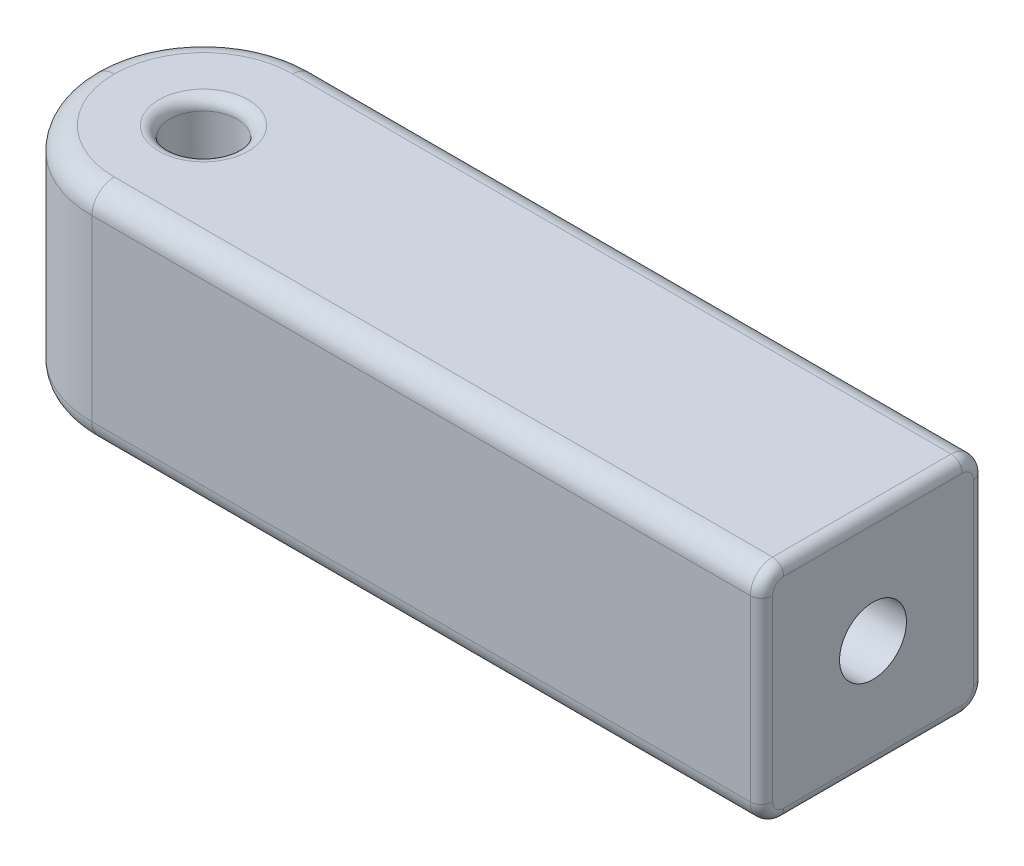
ISO-10303-21;
HEADER;
FILE_DESCRIPTION(('STEP AP214'),'2;1');
FILE_NAME('part.step','',(''),(''),'','','');
FILE_SCHEMA(('AUTOMOTIVE_DESIGN { 1 0 10303 214 1 1 1 1 }'));
ENDSEC;
DATA;
#1=APPLICATION_CONTEXT('core data for automotive mechanical design processes');
#2=APPLICATION_PROTOCOL_DEFINITION('international standard','automotive_design',2000,#1);
#3=PRODUCT_CONTEXT('',#1,'mechanical');
#4=PRODUCT('Part','Part','',(#3));
#5=PRODUCT_RELATED_PRODUCT_CATEGORY('part','',(#4));
#6=PRODUCT_DEFINITION_FORMATION('','',#4);
#7=PRODUCT_DEFINITION_CONTEXT('part definition',#1,'design');
#8=PRODUCT_DEFINITION('design','',#6,#7);
#9=PRODUCT_DEFINITION_SHAPE('','',#8);
#10=(LENGTH_UNIT() NAMED_UNIT(*) SI_UNIT(.MILLI.,.METRE.));
#11=(NAMED_UNIT(*) PLANE_ANGLE_UNIT() SI_UNIT($,.RADIAN.));
#12=(NAMED_UNIT(*) SI_UNIT($,.STERADIAN.) SOLID_ANGLE_UNIT());
#13=UNCERTAINTY_MEASURE_WITH_UNIT(LENGTH_MEASURE(1.E-05),#10,'distance_accuracy_value','');
#14=(GEOMETRIC_REPRESENTATION_CONTEXT(3) GLOBAL_UNCERTAINTY_ASSIGNED_CONTEXT((#13)) GLOBAL_UNIT_ASSIGNED_CONTEXT((#10,
#11,#12)) REPRESENTATION_CONTEXT('',''));
#15=CARTESIAN_POINT('',(0.,0.,0.));
#16=DIRECTION('',(0.,0.,1.));
#17=DIRECTION('',(1.,0.,0.));
#18=AXIS2_PLACEMENT_3D('',#15,#16,#17);
#19=CARTESIAN_POINT('',(0.,0.,50.));
#20=DIRECTION('',(0.,1.,0.));
#21=DIRECTION('',(0.,0.,1.));
#22=AXIS2_PLACEMENT_3D('',#19,#20,#21);
#23=PLANE('',#22);
#24=CARTESIAN_POINT('',(25.,0.,25.));
#25=DIRECTION('',(0.,1.,0.));
#26=DIRECTION('',(0.,0.,1.));
#27=AXIS2_PLACEMENT_3D('',#24,#25,#26);
#28=CIRCLE('',#27,10.);
#29=CARTESIAN_POINT('',(25.,0.,35.));
#30=VERTEX_POINT('',#29);
#31=EDGE_CURVE('E204',#30,#30,#28,.T.);
#32=ORIENTED_EDGE('',*,*,#31,.T.);
#33=EDGE_LOOP('',(#32));
#34=FACE_BOUND('',#33,.T.);
#35=DIRECTION('',(1.,0.,0.));
#36=VECTOR('',#35,1.);
#37=CARTESIAN_POINT('',(175.,0.,5.));
#38=LINE('',#37,#36);
#39=CARTESIAN_POINT('',(25.,0.,5.));
#40=VERTEX_POINT('',#39);
#41=CARTESIAN_POINT('',(172.5,0.,5.));
#42=VERTEX_POINT('',#41);
#43=EDGE_CURVE('E174',#40,#42,#38,.T.);
#44=ORIENTED_EDGE('',*,*,#43,.T.);
#45=DIRECTION('',(0.,0.,-1.));
#46=VECTOR('',#45,1.);
#47=CARTESIAN_POINT('',(172.5,0.,50.));
#48=LINE('',#47,#46);
#49=CARTESIAN_POINT('',(172.5,0.,45.));
#50=VERTEX_POINT('',#49);
#51=EDGE_CURVE('E152',#42,#50,#48,.F.);
#52=ORIENTED_EDGE('',*,*,#51,.T.);
#53=DIRECTION('',(1.,0.,0.));
#54=VECTOR('',#53,1.);
#55=CARTESIAN_POINT('',(0.,0.,45.));
#56=LINE('',#55,#54);
#57=CARTESIAN_POINT('',(25.,0.,45.));
#58=VERTEX_POINT('',#57);
#59=EDGE_CURVE('E145',#50,#58,#56,.F.);
#60=ORIENTED_EDGE('',*,*,#59,.T.);
#61=CARTESIAN_POINT('',(25.,0.,25.));
#62=DIRECTION('',(0.,1.,0.));
#63=DIRECTION('',(0.,0.,1.));
#64=AXIS2_PLACEMENT_3D('',#61,#62,#63);
#65=CIRCLE('',#64,20.);
#66=CARTESIAN_POINT('',(5.,0.,25.));
#67=VERTEX_POINT('',#66);
#68=EDGE_CURVE('E149',#58,#67,#65,.F.);
#69=ORIENTED_EDGE('',*,*,#68,.T.);
#70=CARTESIAN_POINT('',(25.,0.,25.));
#71=DIRECTION('',(0.,1.,0.));
#72=DIRECTION('',(0.,0.,1.));
#73=AXIS2_PLACEMENT_3D('',#70,#71,#72);
#74=CIRCLE('',#73,20.);
#75=EDGE_CURVE('E172',#67,#40,#74,.F.);
#76=ORIENTED_EDGE('',*,*,#75,.T.);
#77=EDGE_LOOP('',(#44,#52,#60,#69,#76));
#78=FACE_BOUND('',#77,.T.);
#79=ADVANCED_FACE('F42',(#34,#78),#23,.F.);
#80=CARTESIAN_POINT('',(175.,0.,50.));
#81=DIRECTION('',(-1.,0.,0.));
#82=DIRECTION('',(0.,0.,1.));
#83=AXIS2_PLACEMENT_3D('',#80,#81,#82);
#84=PLANE('',#83);
#85=CARTESIAN_POINT('',(175.,5.,5.));
#86=DIRECTION('',(-1.,0.,0.));
#87=DIRECTION('',(0.,0.,1.));
#88=AXIS2_PLACEMENT_3D('',#85,#86,#87);
#89=CIRCLE('',#88,2.5);
#90=CARTESIAN_POINT('',(175.,2.5,5.));
#91=VERTEX_POINT('',#90);
#92=CARTESIAN_POINT('',(175.,5.,2.5));
#93=VERTEX_POINT('',#92);
#94=EDGE_CURVE('E238',#91,#93,#89,.F.);
#95=ORIENTED_EDGE('',*,*,#94,.T.);
#96=DIRECTION('',(0.,1.,0.));
#97=VECTOR('',#96,1.);
#98=CARTESIAN_POINT('',(175.,45.,2.5));
#99=LINE('',#98,#97);
#100=CARTESIAN_POINT('',(175.,45.,2.5));
#101=VERTEX_POINT('',#100);
#102=EDGE_CURVE('E242',#93,#101,#99,.T.);
#103=ORIENTED_EDGE('',*,*,#102,.T.);
#104=CARTESIAN_POINT('',(175.,45.,5.));
#105=DIRECTION('',(-1.,0.,0.));
#106=DIRECTION('',(0.,0.,1.));
#107=AXIS2_PLACEMENT_3D('',#104,#105,#106);
#108=CIRCLE('',#107,2.5);
#109=CARTESIAN_POINT('',(175.,47.5,5.));
#110=VERTEX_POINT('',#109);
#111=EDGE_CURVE('E240',#101,#110,#108,.F.);
#112=ORIENTED_EDGE('',*,*,#111,.T.);
#113=DIRECTION('',(0.,0.,-1.));
#114=VECTOR('',#113,1.);
#115=CARTESIAN_POINT('',(175.,47.5,50.));
#116=LINE('',#115,#114);
#117=CARTESIAN_POINT('',(175.,47.5,45.));
#118=VERTEX_POINT('',#117);
#119=EDGE_CURVE('E234',#110,#118,#116,.F.);
#120=ORIENTED_EDGE('',*,*,#119,.T.);
#121=CARTESIAN_POINT('',(175.,45.,45.));
#122=DIRECTION('',(-1.,0.,0.));
#123=DIRECTION('',(0.,0.,1.));
#124=AXIS2_PLACEMENT_3D('',#121,#122,#123);
#125=CIRCLE('',#124,2.5);
#126=CARTESIAN_POINT('',(175.,45.,47.5));
#127=VERTEX_POINT('',#126);
#128=EDGE_CURVE('E229',#118,#127,#125,.F.);
#129=ORIENTED_EDGE('',*,*,#128,.T.);
#130=DIRECTION('',(0.,1.,0.));
#131=VECTOR('',#130,1.);
#132=CARTESIAN_POINT('',(175.,0.,47.5));
#133=LINE('',#132,#131);
#134=CARTESIAN_POINT('',(175.,5.,47.5));
#135=VERTEX_POINT('',#134);
#136=EDGE_CURVE('E227',#127,#135,#133,.F.);
#137=ORIENTED_EDGE('',*,*,#136,.T.);
#138=CARTESIAN_POINT('',(175.,5.,45.));
#139=DIRECTION('',(-1.,0.,0.));
#140=DIRECTION('',(0.,0.,1.));
#141=AXIS2_PLACEMENT_3D('',#138,#139,#140);
#142=CIRCLE('',#141,2.5);
#143=CARTESIAN_POINT('',(175.,2.5,45.));
#144=VERTEX_POINT('',#143);
#145=EDGE_CURVE('E231',#135,#144,#142,.F.);
#146=ORIENTED_EDGE('',*,*,#145,.T.);
#147=DIRECTION('',(0.,0.,-1.));
#148=VECTOR('',#147,1.);
#149=CARTESIAN_POINT('',(175.,2.5,50.));
#150=LINE('',#149,#148);
#151=EDGE_CURVE('E236',#144,#91,#150,.T.);
#152=ORIENTED_EDGE('',*,*,#151,.T.);
#153=EDGE_LOOP('',(#95,#103,#112,#120,#129,#137,#146,#152));
#154=FACE_BOUND('',#153,.T.);
#155=CARTESIAN_POINT('',(175.,25.,25.));
#156=DIRECTION('',(1.,0.,0.));
#157=DIRECTION('',(0.,0.,-1.));
#158=AXIS2_PLACEMENT_3D('',#155,#156,#157);
#159=CIRCLE('',#158,7.5);
#160=CARTESIAN_POINT('',(175.,25.,17.5));
#161=VERTEX_POINT('',#160);
#162=EDGE_CURVE('E166',#161,#161,#159,.T.);
#163=ORIENTED_EDGE('',*,*,#162,.F.);
#164=EDGE_LOOP('',(#163));
#165=FACE_BOUND('',#164,.T.);
#166=ADVANCED_FACE('F316',(#154,#165),#84,.F.);
#167=CARTESIAN_POINT('',(0.,50.,50.));
#168=DIRECTION('',(0.,-1.,0.));
#169=DIRECTION('',(0.,0.,-1.));
#170=AXIS2_PLACEMENT_3D('',#167,#168,#169);
#171=PLANE('',#170);
#172=CARTESIAN_POINT('',(25.,50.,25.));
#173=DIRECTION('',(0.,-1.,0.));
#174=DIRECTION('',(0.,0.,-1.));
#175=AXIS2_PLACEMENT_3D('',#172,#173,#174);
#176=CIRCLE('',#175,10.);
#177=CARTESIAN_POINT('',(25.,50.,15.));
#178=VERTEX_POINT('',#177);
#179=EDGE_CURVE('E224',#178,#178,#176,.T.);
#180=ORIENTED_EDGE('',*,*,#179,.T.);
#181=EDGE_LOOP('',(#180));
#182=FACE_BOUND('',#181,.T.);
#183=DIRECTION('',(-1.,0.,0.));
#184=VECTOR('',#183,1.);
#185=CARTESIAN_POINT('',(0.,50.,45.));
#186=LINE('',#185,#184);
#187=CARTESIAN_POINT('',(25.,50.,45.));
#188=VERTEX_POINT('',#187);
#189=CARTESIAN_POINT('',(172.5,50.,45.));
#190=VERTEX_POINT('',#189);
#191=EDGE_CURVE('E187',#188,#190,#186,.F.);
#192=ORIENTED_EDGE('',*,*,#191,.T.);
#193=DIRECTION('',(0.,0.,-1.));
#194=VECTOR('',#193,1.);
#195=CARTESIAN_POINT('',(172.5,50.,50.));
#196=LINE('',#195,#194);
#197=CARTESIAN_POINT('',(172.5,50.,5.));
#198=VERTEX_POINT('',#197);
#199=EDGE_CURVE('E51',#190,#198,#196,.T.);
#200=ORIENTED_EDGE('',*,*,#199,.T.);
#201=DIRECTION('',(-1.,0.,0.));
#202=VECTOR('',#201,1.);
#203=CARTESIAN_POINT('',(25.,50.,5.));
#204=LINE('',#203,#202);
#205=CARTESIAN_POINT('',(25.,50.,5.));
#206=VERTEX_POINT('',#205);
#207=EDGE_CURVE('E195',#198,#206,#204,.T.);
#208=ORIENTED_EDGE('',*,*,#207,.T.);
#209=CARTESIAN_POINT('',(25.,50.,25.));
#210=DIRECTION('',(0.,-1.,0.));
#211=DIRECTION('',(0.,0.,-1.));
#212=AXIS2_PLACEMENT_3D('',#209,#210,#211);
#213=CIRCLE('',#212,20.);
#214=CARTESIAN_POINT('',(5.,50.,25.));
#215=VERTEX_POINT('',#214);
#216=EDGE_CURVE('E192',#206,#215,#213,.F.);
#217=ORIENTED_EDGE('',*,*,#216,.T.);
#218=CARTESIAN_POINT('',(25.,50.,25.));
#219=DIRECTION('',(0.,-1.,0.));
#220=DIRECTION('',(0.,0.,-1.));
#221=AXIS2_PLACEMENT_3D('',#218,#219,#220);
#222=CIRCLE('',#221,20.);
#223=EDGE_CURVE('E190',#215,#188,#222,.F.);
#224=ORIENTED_EDGE('',*,*,#223,.T.);
#225=EDGE_LOOP('',(#192,#200,#208,#217,#224));
#226=FACE_BOUND('',#225,.T.);
#227=ADVANCED_FACE('F318',(#182,#226),#171,.F.);
#228=CARTESIAN_POINT('',(0.,0.,50.));
#229=DIRECTION('',(0.,0.,-1.));
#230=DIRECTION('',(-1.,0.,0.));
#231=AXIS2_PLACEMENT_3D('',#228,#229,#230);
#232=PLANE('',#231);
#233=DIRECTION('',(1.,0.,0.));
#234=VECTOR('',#233,1.);
#235=CARTESIAN_POINT('',(0.,5.,50.));
#236=LINE('',#235,#234);
#237=CARTESIAN_POINT('',(25.,5.,50.));
#238=VERTEX_POINT('',#237);
#239=CARTESIAN_POINT('',(172.5,5.,50.));
#240=VERTEX_POINT('',#239);
#241=EDGE_CURVE('E163',#238,#240,#236,.T.);
#242=ORIENTED_EDGE('',*,*,#241,.T.);
#243=DIRECTION('',(0.,1.,0.));
#244=VECTOR('',#243,1.);
#245=CARTESIAN_POINT('',(172.5,0.,50.));
#246=LINE('',#245,#244);
#247=CARTESIAN_POINT('',(172.5,45.,50.));
#248=VERTEX_POINT('',#247);
#249=EDGE_CURVE('E11',#240,#248,#246,.T.);
#250=ORIENTED_EDGE('',*,*,#249,.T.);
#251=DIRECTION('',(-1.,0.,0.));
#252=VECTOR('',#251,1.);
#253=CARTESIAN_POINT('',(0.,45.,50.));
#254=LINE('',#253,#252);
#255=CARTESIAN_POINT('',(25.,45.,50.));
#256=VERTEX_POINT('',#255);
#257=EDGE_CURVE('E201',#248,#256,#254,.T.);
#258=ORIENTED_EDGE('',*,*,#257,.T.);
#259=DIRECTION('',(0.,-1.,0.));
#260=VECTOR('',#259,1.);
#261=CARTESIAN_POINT('',(25.,0.,50.));
#262=LINE('',#261,#260);
#263=EDGE_CURVE('E156',#256,#238,#262,.T.);
#264=ORIENTED_EDGE('',*,*,#263,.T.);
#265=EDGE_LOOP('',(#242,#250,#258,#264));
#266=FACE_BOUND('',#265,.T.);
#267=ADVANCED_FACE('F325',(#266),#232,.F.);
#268=CARTESIAN_POINT('',(0.,0.,0.));
#269=DIRECTION('',(0.,0.,-1.));
#270=DIRECTION('',(-1.,0.,0.));
#271=AXIS2_PLACEMENT_3D('',#268,#269,#270);
#272=PLANE('',#271);
#273=DIRECTION('',(-1.,0.,0.));
#274=VECTOR('',#273,1.);
#275=CARTESIAN_POINT('',(175.,45.,0.));
#276=LINE('',#275,#274);
#277=CARTESIAN_POINT('',(25.,45.,0.));
#278=VERTEX_POINT('',#277);
#279=CARTESIAN_POINT('',(172.5,45.,0.));
#280=VERTEX_POINT('',#279);
#281=EDGE_CURVE('E197',#278,#280,#276,.F.);
#282=ORIENTED_EDGE('',*,*,#281,.T.);
#283=DIRECTION('',(0.,1.,0.));
#284=VECTOR('',#283,1.);
#285=CARTESIAN_POINT('',(172.5,5.,0.));
#286=LINE('',#285,#284);
#287=CARTESIAN_POINT('',(172.5,5.,0.));
#288=VERTEX_POINT('',#287);
#289=EDGE_CURVE('E59',#280,#288,#286,.F.);
#290=ORIENTED_EDGE('',*,*,#289,.T.);
#291=DIRECTION('',(1.,0.,0.));
#292=VECTOR('',#291,1.);
#293=CARTESIAN_POINT('',(25.,5.,0.));
#294=LINE('',#293,#292);
#295=CARTESIAN_POINT('',(25.,5.,0.));
#296=VERTEX_POINT('',#295);
#297=EDGE_CURVE('E199',#288,#296,#294,.F.);
#298=ORIENTED_EDGE('',*,*,#297,.T.);
#299=DIRECTION('',(0.,-1.,0.));
#300=VECTOR('',#299,1.);
#301=CARTESIAN_POINT('',(25.,50.,0.));
#302=LINE('',#301,#300);
#303=EDGE_CURVE('E292',#296,#278,#302,.F.);
#304=ORIENTED_EDGE('',*,*,#303,.T.);
#305=EDGE_LOOP('',(#282,#290,#298,#304));
#306=FACE_BOUND('',#305,.T.);
#307=ADVANCED_FACE('F290',(#306),#272,.T.);
#308=CARTESIAN_POINT('',(25.,0.,25.));
#309=DIRECTION('',(0.,-1.,0.));
#310=DIRECTION('',(0.,0.,-1.));
#311=AXIS2_PLACEMENT_3D('',#308,#309,#310);
#312=CYLINDRICAL_SURFACE('',#311,25.);
#313=DIRECTION('',(0.,-1.,0.));
#314=VECTOR('',#313,1.);
#315=CARTESIAN_POINT('',(0.,0.,25.));
#316=LINE('',#315,#314);
#317=CARTESIAN_POINT('',(0.,5.,25.));
#318=VERTEX_POINT('',#317);
#319=CARTESIAN_POINT('',(0.,45.,25.));
#320=VERTEX_POINT('',#319);
#321=EDGE_CURVE('E295',#318,#320,#316,.F.);
#322=ORIENTED_EDGE('',*,*,#321,.F.);
#323=CARTESIAN_POINT('',(25.,5.,25.));
#324=DIRECTION('',(0.,1.,0.));
#325=DIRECTION('',(0.,0.,1.));
#326=AXIS2_PLACEMENT_3D('',#323,#324,#325);
#327=CIRCLE('',#326,25.);
#328=EDGE_CURVE('E185',#318,#238,#327,.T.);
#329=ORIENTED_EDGE('',*,*,#328,.T.);
#330=ORIENTED_EDGE('',*,*,#263,.F.);
#331=CARTESIAN_POINT('',(25.,45.,25.));
#332=DIRECTION('',(0.,-1.,0.));
#333=DIRECTION('',(0.,0.,-1.));
#334=AXIS2_PLACEMENT_3D('',#331,#332,#333);
#335=CIRCLE('',#334,25.);
#336=EDGE_CURVE('E183',#256,#320,#335,.T.);
#337=ORIENTED_EDGE('',*,*,#336,.T.);
#338=EDGE_LOOP('',(#322,#329,#330,#337));
#339=FACE_BOUND('',#338,.T.);
#340=ADVANCED_FACE('F334',(#339),#312,.T.);
#341=CARTESIAN_POINT('',(25.,0.,25.));
#342=DIRECTION('',(0.,1.,0.));
#343=DIRECTION('',(0.,0.,1.));
#344=AXIS2_PLACEMENT_3D('',#341,#342,#343);
#345=CYLINDRICAL_SURFACE('',#344,25.);
#346=ORIENTED_EDGE('',*,*,#303,.F.);
#347=CARTESIAN_POINT('',(25.,5.,25.));
#348=DIRECTION('',(0.,1.,0.));
#349=DIRECTION('',(0.,0.,1.));
#350=AXIS2_PLACEMENT_3D('',#347,#348,#349);
#351=CIRCLE('',#350,25.);
#352=EDGE_CURVE('E181',#296,#318,#351,.T.);
#353=ORIENTED_EDGE('',*,*,#352,.T.);
#354=ORIENTED_EDGE('',*,*,#321,.T.);
#355=CARTESIAN_POINT('',(25.,45.,25.));
#356=DIRECTION('',(0.,-1.,0.));
#357=DIRECTION('',(0.,0.,-1.));
#358=AXIS2_PLACEMENT_3D('',#355,#356,#357);
#359=CIRCLE('',#358,25.);
#360=EDGE_CURVE('E179',#320,#278,#359,.T.);
#361=ORIENTED_EDGE('',*,*,#360,.T.);
#362=EDGE_LOOP('',(#346,#353,#354,#361));
#363=FACE_BOUND('',#362,.T.);
#364=ADVANCED_FACE('F312',(#363),#345,.T.);
#365=CARTESIAN_POINT('',(160.,25.,25.));
#366=DIRECTION('',(1.,0.,0.));
#367=DIRECTION('',(0.,0.,-1.));
#368=AXIS2_PLACEMENT_3D('',#365,#366,#367);
#369=CYLINDRICAL_SURFACE('',#368,7.5);
#370=CARTESIAN_POINT('',(160.,25.,25.));
#371=DIRECTION('',(1.,0.,0.));
#372=DIRECTION('',(0.,0.,-1.));
#373=AXIS2_PLACEMENT_3D('',#370,#371,#372);
#374=CIRCLE('',#373,7.5);
#375=CARTESIAN_POINT('',(160.,25.,17.5));
#376=VERTEX_POINT('',#375);
#377=EDGE_CURVE('E300',#376,#376,#374,.T.);
#378=ORIENTED_EDGE('',*,*,#377,.F.);
#379=EDGE_LOOP('',(#378));
#380=FACE_BOUND('',#379,.T.);
#381=ORIENTED_EDGE('',*,*,#162,.T.);
#382=EDGE_LOOP('',(#381));
#383=FACE_BOUND('',#382,.T.);
#384=ADVANCED_FACE('F309',(#380,#383),#369,.F.);
#385=CARTESIAN_POINT('',(160.,25.,25.));
#386=DIRECTION('',(1.,0.,0.));
#387=DIRECTION('',(0.,0.,-1.));
#388=AXIS2_PLACEMENT_3D('',#385,#386,#387);
#389=PLANE('',#388);
#390=ORIENTED_EDGE('',*,*,#377,.T.);
#391=EDGE_LOOP('',(#390));
#392=FACE_BOUND('',#391,.T.);
#393=ADVANCED_FACE('F307',(#392),#389,.T.);
#394=CARTESIAN_POINT('',(25.,0.,25.));
#395=DIRECTION('',(0.,1.,0.));
#396=DIRECTION('',(0.,0.,1.));
#397=AXIS2_PLACEMENT_3D('',#394,#395,#396);
#398=CYLINDRICAL_SURFACE('',#397,7.5);
#399=CARTESIAN_POINT('',(25.,2.5,25.));
#400=DIRECTION('',(0.,1.,0.));
#401=DIRECTION('',(0.,0.,1.));
#402=AXIS2_PLACEMENT_3D('',#399,#400,#401);
#403=CIRCLE('',#402,7.5);
#404=CARTESIAN_POINT('',(25.,2.5,32.5));
#405=VERTEX_POINT('',#404);
#406=EDGE_CURVE('E221',#405,#405,#403,.F.);
#407=ORIENTED_EDGE('',*,*,#406,.T.);
#408=EDGE_LOOP('',(#407));
#409=FACE_BOUND('',#408,.T.);
#410=CARTESIAN_POINT('',(25.,47.5,25.));
#411=DIRECTION('',(0.,-1.,0.));
#412=DIRECTION('',(0.,0.,-1.));
#413=AXIS2_PLACEMENT_3D('',#410,#411,#412);
#414=CIRCLE('',#413,7.5);
#415=CARTESIAN_POINT('',(25.,47.5,17.5));
#416=VERTEX_POINT('',#415);
#417=EDGE_CURVE('E218',#416,#416,#414,.F.);
#418=ORIENTED_EDGE('',*,*,#417,.T.);
#419=EDGE_LOOP('',(#418));
#420=FACE_BOUND('',#419,.T.);
#421=ADVANCED_FACE('F350',(#409,#420),#398,.F.);
#422=CARTESIAN_POINT('',(0.,5.,45.));
#423=DIRECTION('',(1.,0.,0.));
#424=DIRECTION('',(0.,0.,-1.));
#425=AXIS2_PLACEMENT_3D('',#422,#423,#424);
#426=CYLINDRICAL_SURFACE('',#425,5.);
#427=ORIENTED_EDGE('',*,*,#59,.F.);
#428=CARTESIAN_POINT('',(172.5,5.,45.));
#429=DIRECTION('',(-1.,0.,0.));
#430=DIRECTION('',(0.,0.,1.));
#431=AXIS2_PLACEMENT_3D('',#428,#429,#430);
#432=CIRCLE('',#431,5.);
#433=EDGE_CURVE('E244',#50,#240,#432,.T.);
#434=ORIENTED_EDGE('',*,*,#433,.T.);
#435=ORIENTED_EDGE('',*,*,#241,.F.);
#436=CARTESIAN_POINT('',(25.,5.,45.));
#437=DIRECTION('',(-1.,0.,0.));
#438=DIRECTION('',(0.,0.,1.));
#439=AXIS2_PLACEMENT_3D('',#436,#437,#438);
#440=CIRCLE('',#439,5.);
#441=EDGE_CURVE('E160',#58,#238,#440,.T.);
#442=ORIENTED_EDGE('',*,*,#441,.F.);
#443=EDGE_LOOP('',(#427,#434,#435,#442));
#444=FACE_BOUND('',#443,.T.);
#445=ADVANCED_FACE('F161',(#444),#426,.T.);
#446=CARTESIAN_POINT('',(25.,5.,25.));
#447=DIRECTION('',(0.,1.,0.));
#448=DIRECTION('',(0.,0.,1.));
#449=AXIS2_PLACEMENT_3D('',#446,#447,#448);
#450=TOROIDAL_SURFACE('',#449,20.,5.);
#451=ORIENTED_EDGE('',*,*,#441,.T.);
#452=ORIENTED_EDGE('',*,*,#328,.F.);
#453=CARTESIAN_POINT('',(5.,5.,25.));
#454=DIRECTION('',(0.,0.,-1.));
#455=DIRECTION('',(-1.,0.,0.));
#456=AXIS2_PLACEMENT_3D('',#453,#454,#455);
#457=CIRCLE('',#456,5.);
#458=EDGE_CURVE('E167',#67,#318,#457,.T.);
#459=ORIENTED_EDGE('',*,*,#458,.F.);
#460=ORIENTED_EDGE('',*,*,#68,.F.);
#461=EDGE_LOOP('',(#451,#452,#459,#460));
#462=FACE_BOUND('',#461,.T.);
#463=ADVANCED_FACE('F169',(#462),#450,.T.);
#464=CARTESIAN_POINT('',(0.,5.,5.));
#465=DIRECTION('',(-1.,0.,0.));
#466=DIRECTION('',(0.,0.,1.));
#467=AXIS2_PLACEMENT_3D('',#464,#465,#466);
#468=CYLINDRICAL_SURFACE('',#467,5.);
#469=ORIENTED_EDGE('',*,*,#297,.F.);
#470=CARTESIAN_POINT('',(172.5,5.,5.));
#471=DIRECTION('',(-1.,0.,0.));
#472=DIRECTION('',(0.,0.,1.));
#473=AXIS2_PLACEMENT_3D('',#470,#471,#472);
#474=CIRCLE('',#473,5.);
#475=EDGE_CURVE('E66',#288,#42,#474,.T.);
#476=ORIENTED_EDGE('',*,*,#475,.T.);
#477=ORIENTED_EDGE('',*,*,#43,.F.);
#478=CARTESIAN_POINT('',(25.,5.,5.));
#479=DIRECTION('',(-1.,0.,0.));
#480=DIRECTION('',(0.,0.,1.));
#481=AXIS2_PLACEMENT_3D('',#478,#479,#480);
#482=CIRCLE('',#481,5.);
#483=EDGE_CURVE('E205',#296,#40,#482,.T.);
#484=ORIENTED_EDGE('',*,*,#483,.F.);
#485=EDGE_LOOP('',(#469,#476,#477,#484));
#486=FACE_BOUND('',#485,.T.);
#487=ADVANCED_FACE('F342',(#486),#468,.T.);
#488=CARTESIAN_POINT('',(25.,5.,25.));
#489=DIRECTION('',(0.,1.,0.));
#490=DIRECTION('',(0.,0.,1.));
#491=AXIS2_PLACEMENT_3D('',#488,#489,#490);
#492=TOROIDAL_SURFACE('',#491,20.,5.);
#493=ORIENTED_EDGE('',*,*,#458,.T.);
#494=ORIENTED_EDGE('',*,*,#352,.F.);
#495=ORIENTED_EDGE('',*,*,#483,.T.);
#496=ORIENTED_EDGE('',*,*,#75,.F.);
#497=EDGE_LOOP('',(#493,#494,#495,#496));
#498=FACE_BOUND('',#497,.T.);
#499=ADVANCED_FACE('F338',(#498),#492,.T.);
#500=CARTESIAN_POINT('',(0.,45.,45.));
#501=DIRECTION('',(-1.,0.,0.));
#502=DIRECTION('',(0.,0.,1.));
#503=AXIS2_PLACEMENT_3D('',#500,#501,#502);
#504=CYLINDRICAL_SURFACE('',#503,5.);
#505=ORIENTED_EDGE('',*,*,#257,.F.);
#506=CARTESIAN_POINT('',(172.5,45.,45.));
#507=DIRECTION('',(-1.,0.,0.));
#508=DIRECTION('',(0.,0.,1.));
#509=AXIS2_PLACEMENT_3D('',#506,#507,#508);
#510=CIRCLE('',#509,5.);
#511=EDGE_CURVE('E246',#248,#190,#510,.T.);
#512=ORIENTED_EDGE('',*,*,#511,.T.);
#513=ORIENTED_EDGE('',*,*,#191,.F.);
#514=CARTESIAN_POINT('',(25.,45.,45.));
#515=DIRECTION('',(-1.,0.,0.));
#516=DIRECTION('',(0.,0.,1.));
#517=AXIS2_PLACEMENT_3D('',#514,#515,#516);
#518=CIRCLE('',#517,5.);
#519=EDGE_CURVE('E207',#256,#188,#518,.T.);
#520=ORIENTED_EDGE('',*,*,#519,.F.);
#521=EDGE_LOOP('',(#505,#512,#513,#520));
#522=FACE_BOUND('',#521,.T.);
#523=ADVANCED_FACE('F341',(#522),#504,.T.);
#524=CARTESIAN_POINT('',(0.,45.,5.));
#525=DIRECTION('',(1.,0.,0.));
#526=DIRECTION('',(0.,0.,-1.));
#527=AXIS2_PLACEMENT_3D('',#524,#525,#526);
#528=CYLINDRICAL_SURFACE('',#527,5.);
#529=ORIENTED_EDGE('',*,*,#207,.F.);
#530=CARTESIAN_POINT('',(172.5,45.,5.));
#531=DIRECTION('',(-1.,0.,0.));
#532=DIRECTION('',(0.,0.,1.));
#533=AXIS2_PLACEMENT_3D('',#530,#531,#532);
#534=CIRCLE('',#533,5.);
#535=EDGE_CURVE('E248',#198,#280,#534,.T.);
#536=ORIENTED_EDGE('',*,*,#535,.T.);
#537=ORIENTED_EDGE('',*,*,#281,.F.);
#538=CARTESIAN_POINT('',(25.,45.,5.));
#539=DIRECTION('',(-1.,0.,0.));
#540=DIRECTION('',(0.,0.,1.));
#541=AXIS2_PLACEMENT_3D('',#538,#539,#540);
#542=CIRCLE('',#541,5.);
#543=EDGE_CURVE('E211',#206,#278,#542,.T.);
#544=ORIENTED_EDGE('',*,*,#543,.F.);
#545=EDGE_LOOP('',(#529,#536,#537,#544));
#546=FACE_BOUND('',#545,.T.);
#547=ADVANCED_FACE('F287',(#546),#528,.T.);
#548=CARTESIAN_POINT('',(25.,45.,25.));
#549=DIRECTION('',(0.,-1.,0.));
#550=DIRECTION('',(0.,0.,-1.));
#551=AXIS2_PLACEMENT_3D('',#548,#549,#550);
#552=TOROIDAL_SURFACE('',#551,20.,5.);
#553=ORIENTED_EDGE('',*,*,#519,.T.);
#554=ORIENTED_EDGE('',*,*,#223,.F.);
#555=CARTESIAN_POINT('',(5.,45.,25.));
#556=DIRECTION('',(0.,0.,-1.));
#557=DIRECTION('',(-1.,0.,0.));
#558=AXIS2_PLACEMENT_3D('',#555,#556,#557);
#559=CIRCLE('',#558,5.);
#560=EDGE_CURVE('E209',#320,#215,#559,.T.);
#561=ORIENTED_EDGE('',*,*,#560,.F.);
#562=ORIENTED_EDGE('',*,*,#336,.F.);
#563=EDGE_LOOP('',(#553,#554,#561,#562));
#564=FACE_BOUND('',#563,.T.);
#565=ADVANCED_FACE('F355',(#564),#552,.T.);
#566=CARTESIAN_POINT('',(25.,45.,25.));
#567=DIRECTION('',(0.,-1.,0.));
#568=DIRECTION('',(0.,0.,-1.));
#569=AXIS2_PLACEMENT_3D('',#566,#567,#568);
#570=TOROIDAL_SURFACE('',#569,20.,5.);
#571=ORIENTED_EDGE('',*,*,#543,.T.);
#572=ORIENTED_EDGE('',*,*,#360,.F.);
#573=ORIENTED_EDGE('',*,*,#560,.T.);
#574=ORIENTED_EDGE('',*,*,#216,.F.);
#575=EDGE_LOOP('',(#571,#572,#573,#574));
#576=FACE_BOUND('',#575,.T.);
#577=ADVANCED_FACE('F351',(#576),#570,.T.);
#578=CARTESIAN_POINT('',(25.,2.5,25.));
#579=DIRECTION('',(0.,1.,0.));
#580=DIRECTION('',(0.,0.,1.));
#581=AXIS2_PLACEMENT_3D('',#578,#579,#580);
#582=TOROIDAL_SURFACE('',#581,10.,2.5);
#583=ORIENTED_EDGE('',*,*,#406,.F.);
#584=EDGE_LOOP('',(#583));
#585=FACE_BOUND('',#584,.T.);
#586=ORIENTED_EDGE('',*,*,#31,.F.);
#587=EDGE_LOOP('',(#586));
#588=FACE_BOUND('',#587,.T.);
#589=ADVANCED_FACE('F354',(#585,#588),#582,.T.);
#590=CARTESIAN_POINT('',(25.,47.5,25.));
#591=DIRECTION('',(0.,-1.,0.));
#592=DIRECTION('',(0.,0.,-1.));
#593=AXIS2_PLACEMENT_3D('',#590,#591,#592);
#594=TOROIDAL_SURFACE('',#593,10.,2.5);
#595=ORIENTED_EDGE('',*,*,#179,.F.);
#596=EDGE_LOOP('',(#595));
#597=FACE_BOUND('',#596,.T.);
#598=ORIENTED_EDGE('',*,*,#417,.F.);
#599=EDGE_LOOP('',(#598));
#600=FACE_BOUND('',#599,.T.);
#601=ADVANCED_FACE('F367',(#597,#600),#594,.T.);
#602=CARTESIAN_POINT('',(172.5,45.,5.));
#603=DIRECTION('',(-1.,0.,0.));
#604=DIRECTION('',(0.,0.,1.));
#605=AXIS2_PLACEMENT_3D('',#602,#603,#604);
#606=DEGENERATE_TOROIDAL_SURFACE('',#605,2.5,2.5,.T.);
#607=CARTESIAN_POINT('',(172.5,45.,2.5));
#608=DIRECTION('',(0.,-1.,0.));
#609=DIRECTION('',(0.,0.,-1.));
#610=AXIS2_PLACEMENT_3D('',#607,#608,#609);
#611=CIRCLE('',#610,2.5);
#612=EDGE_CURVE('E269',#280,#101,#611,.T.);
#613=ORIENTED_EDGE('',*,*,#612,.F.);
#614=ORIENTED_EDGE('',*,*,#535,.F.);
#615=CARTESIAN_POINT('',(172.5,47.5,5.));
#616=DIRECTION('',(0.,0.,1.));
#617=DIRECTION('',(1.,0.,0.));
#618=AXIS2_PLACEMENT_3D('',#615,#616,#617);
#619=CIRCLE('',#618,2.5);
#620=EDGE_CURVE('E46',#110,#198,#619,.T.);
#621=ORIENTED_EDGE('',*,*,#620,.F.);
#622=ORIENTED_EDGE('',*,*,#111,.F.);
#623=EDGE_LOOP('',(#613,#614,#621,#622));
#624=FACE_BOUND('',#623,.T.);
#625=ADVANCED_FACE('F44',(#624),#606,.T.);
#626=CARTESIAN_POINT('',(172.5,47.5,50.));
#627=DIRECTION('',(0.,0.,-1.));
#628=DIRECTION('',(-1.,0.,0.));
#629=AXIS2_PLACEMENT_3D('',#626,#627,#628);
#630=CYLINDRICAL_SURFACE('',#629,2.5);
#631=ORIENTED_EDGE('',*,*,#620,.T.);
#632=ORIENTED_EDGE('',*,*,#199,.F.);
#633=CARTESIAN_POINT('',(172.5,47.5,45.));
#634=DIRECTION('',(0.,0.,1.));
#635=DIRECTION('',(1.,0.,0.));
#636=AXIS2_PLACEMENT_3D('',#633,#634,#635);
#637=CIRCLE('',#636,2.5);
#638=EDGE_CURVE('E267',#118,#190,#637,.T.);
#639=ORIENTED_EDGE('',*,*,#638,.F.);
#640=ORIENTED_EDGE('',*,*,#119,.F.);
#641=EDGE_LOOP('',(#631,#632,#639,#640));
#642=FACE_BOUND('',#641,.T.);
#643=ADVANCED_FACE('F279',(#642),#630,.T.);
#644=CARTESIAN_POINT('',(172.5,0.,2.5));
#645=DIRECTION('',(0.,-1.,0.));
#646=DIRECTION('',(0.,0.,-1.));
#647=AXIS2_PLACEMENT_3D('',#644,#645,#646);
#648=CYLINDRICAL_SURFACE('',#647,2.5);
#649=ORIENTED_EDGE('',*,*,#612,.T.);
#650=ORIENTED_EDGE('',*,*,#102,.F.);
#651=CARTESIAN_POINT('',(172.5,5.,2.5));
#652=DIRECTION('',(0.,-1.,0.));
#653=DIRECTION('',(0.,0.,-1.));
#654=AXIS2_PLACEMENT_3D('',#651,#652,#653);
#655=CIRCLE('',#654,2.5);
#656=EDGE_CURVE('E264',#288,#93,#655,.T.);
#657=ORIENTED_EDGE('',*,*,#656,.F.);
#658=ORIENTED_EDGE('',*,*,#289,.F.);
#659=EDGE_LOOP('',(#649,#650,#657,#658));
#660=FACE_BOUND('',#659,.T.);
#661=ADVANCED_FACE('F391',(#660),#648,.T.);
#662=CARTESIAN_POINT('',(172.5,45.,45.));
#663=DIRECTION('',(-1.,0.,0.));
#664=DIRECTION('',(0.,0.,1.));
#665=AXIS2_PLACEMENT_3D('',#662,#663,#664);
#666=DEGENERATE_TOROIDAL_SURFACE('',#665,2.5,2.5,.T.);
#667=ORIENTED_EDGE('',*,*,#638,.T.);
#668=ORIENTED_EDGE('',*,*,#511,.F.);
#669=CARTESIAN_POINT('',(172.5,45.,47.5));
#670=DIRECTION('',(0.,-1.,0.));
#671=DIRECTION('',(0.,0.,-1.));
#672=AXIS2_PLACEMENT_3D('',#669,#670,#671);
#673=CIRCLE('',#672,2.5);
#674=EDGE_CURVE('E261',#127,#248,#673,.T.);
#675=ORIENTED_EDGE('',*,*,#674,.F.);
#676=ORIENTED_EDGE('',*,*,#128,.F.);
#677=EDGE_LOOP('',(#667,#668,#675,#676));
#678=FACE_BOUND('',#677,.T.);
#679=ADVANCED_FACE('F387',(#678),#666,.T.);
#680=CARTESIAN_POINT('',(172.5,5.,5.));
#681=DIRECTION('',(-1.,0.,0.));
#682=DIRECTION('',(0.,0.,1.));
#683=AXIS2_PLACEMENT_3D('',#680,#681,#682);
#684=DEGENERATE_TOROIDAL_SURFACE('',#683,2.5,2.5,.T.);
#685=ORIENTED_EDGE('',*,*,#656,.T.);
#686=ORIENTED_EDGE('',*,*,#94,.F.);
#687=CARTESIAN_POINT('',(172.5,2.5,5.));
#688=DIRECTION('',(0.,0.,1.));
#689=DIRECTION('',(1.,0.,0.));
#690=AXIS2_PLACEMENT_3D('',#687,#688,#689);
#691=CIRCLE('',#690,2.5);
#692=EDGE_CURVE('E258',#42,#91,#691,.T.);
#693=ORIENTED_EDGE('',*,*,#692,.F.);
#694=ORIENTED_EDGE('',*,*,#475,.F.);
#695=EDGE_LOOP('',(#685,#686,#693,#694));
#696=FACE_BOUND('',#695,.T.);
#697=ADVANCED_FACE('F383',(#696),#684,.T.);
#698=CARTESIAN_POINT('',(172.5,0.,47.5));
#699=DIRECTION('',(0.,1.,0.));
#700=DIRECTION('',(0.,0.,1.));
#701=AXIS2_PLACEMENT_3D('',#698,#699,#700);
#702=CYLINDRICAL_SURFACE('',#701,2.5);
#703=ORIENTED_EDGE('',*,*,#674,.T.);
#704=ORIENTED_EDGE('',*,*,#249,.F.);
#705=CARTESIAN_POINT('',(172.5,5.,47.5));
#706=DIRECTION('',(0.,-1.,0.));
#707=DIRECTION('',(0.,0.,-1.));
#708=AXIS2_PLACEMENT_3D('',#705,#706,#707);
#709=CIRCLE('',#708,2.5);
#710=EDGE_CURVE('E256',#135,#240,#709,.T.);
#711=ORIENTED_EDGE('',*,*,#710,.F.);
#712=ORIENTED_EDGE('',*,*,#136,.F.);
#713=EDGE_LOOP('',(#703,#704,#711,#712));
#714=FACE_BOUND('',#713,.T.);
#715=ADVANCED_FACE('F379',(#714),#702,.T.);
#716=CARTESIAN_POINT('',(172.5,2.5,50.));
#717=DIRECTION('',(0.,0.,-1.));
#718=DIRECTION('',(-1.,0.,0.));
#719=AXIS2_PLACEMENT_3D('',#716,#717,#718);
#720=CYLINDRICAL_SURFACE('',#719,2.5);
#721=ORIENTED_EDGE('',*,*,#692,.T.);
#722=ORIENTED_EDGE('',*,*,#151,.F.);
#723=CARTESIAN_POINT('',(172.5,2.5,45.));
#724=DIRECTION('',(0.,0.,1.));
#725=DIRECTION('',(1.,0.,0.));
#726=AXIS2_PLACEMENT_3D('',#723,#724,#725);
#727=CIRCLE('',#726,2.5);
#728=EDGE_CURVE('E254',#50,#144,#727,.T.);
#729=ORIENTED_EDGE('',*,*,#728,.F.);
#730=ORIENTED_EDGE('',*,*,#51,.F.);
#731=EDGE_LOOP('',(#721,#722,#729,#730));
#732=FACE_BOUND('',#731,.T.);
#733=ADVANCED_FACE('F375',(#732),#720,.T.);
#734=CARTESIAN_POINT('',(172.5,5.,45.));
#735=DIRECTION('',(-1.,0.,0.));
#736=DIRECTION('',(0.,0.,1.));
#737=AXIS2_PLACEMENT_3D('',#734,#735,#736);
#738=DEGENERATE_TOROIDAL_SURFACE('',#737,2.5,2.5,.T.);
#739=ORIENTED_EDGE('',*,*,#710,.T.);
#740=ORIENTED_EDGE('',*,*,#433,.F.);
#741=ORIENTED_EDGE('',*,*,#728,.T.);
#742=ORIENTED_EDGE('',*,*,#145,.F.);
#743=EDGE_LOOP('',(#739,#740,#741,#742));
#744=FACE_BOUND('',#743,.T.);
#745=ADVANCED_FACE('F372',(#744),#738,.T.);
#746=CLOSED_SHELL('',(#79,#166,#227,#267,#307,#340,#364,#384,#393,#421,#445,#463,#487,#499,#523,
#547,#565,#577,#589,#601,#625,#643,#661,#679,#697,#715,#733,#745));
#747=MANIFOLD_SOLID_BREP('B2',#746);
#748=ADVANCED_BREP_SHAPE_REPRESENTATION('',(#18,#747),#14);
#749=SHAPE_DEFINITION_REPRESENTATION(#9,#748);
ENDSEC;
END-ISO-10303-21;
